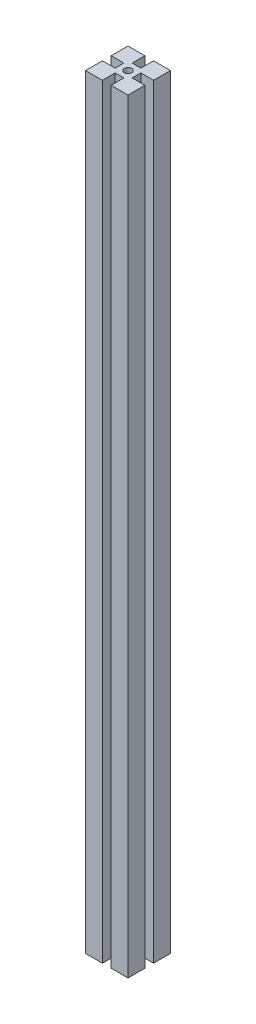
ISO-10303-21;
HEADER;
FILE_DESCRIPTION(('STEP AP214'),'2;1');
FILE_NAME('part.step','',(''),(''),'','','');
FILE_SCHEMA(('AUTOMOTIVE_DESIGN { 1 0 10303 214 1 1 1 1 }'));
ENDSEC;
DATA;
#1=APPLICATION_CONTEXT('core data for automotive mechanical design processes');
#2=APPLICATION_PROTOCOL_DEFINITION('international standard','automotive_design',2000,#1);
#3=PRODUCT_CONTEXT('',#1,'mechanical');
#4=PRODUCT('Part','Part','',(#3));
#5=PRODUCT_RELATED_PRODUCT_CATEGORY('part','',(#4));
#6=PRODUCT_DEFINITION_FORMATION('','',#4);
#7=PRODUCT_DEFINITION_CONTEXT('part definition',#1,'design');
#8=PRODUCT_DEFINITION('design','',#6,#7);
#9=PRODUCT_DEFINITION_SHAPE('','',#8);
#10=(LENGTH_UNIT() NAMED_UNIT(*) SI_UNIT(.MILLI.,.METRE.));
#11=(NAMED_UNIT(*) PLANE_ANGLE_UNIT() SI_UNIT($,.RADIAN.));
#12=(NAMED_UNIT(*) SI_UNIT($,.STERADIAN.) SOLID_ANGLE_UNIT());
#13=UNCERTAINTY_MEASURE_WITH_UNIT(LENGTH_MEASURE(1.E-05),#10,'distance_accuracy_value','');
#14=(GEOMETRIC_REPRESENTATION_CONTEXT(3) GLOBAL_UNCERTAINTY_ASSIGNED_CONTEXT((#13)) GLOBAL_UNIT_ASSIGNED_CONTEXT((#10,
#11,#12)) REPRESENTATION_CONTEXT('',''));
#15=CARTESIAN_POINT('',(0.,0.,0.));
#16=DIRECTION('',(0.,0.,1.));
#17=DIRECTION('',(1.,0.,0.));
#18=AXIS2_PLACEMENT_3D('',#15,#16,#17);
#19=CARTESIAN_POINT('',(0.,720.,0.));
#20=DIRECTION('',(0.,1.,0.));
#21=DIRECTION('',(0.,0.,1.));
#22=AXIS2_PLACEMENT_3D('',#19,#20,#21);
#23=PLANE('',#22);
#24=DIRECTION('',(0.,0.,-1.));
#25=VECTOR('',#24,1.);
#26=CARTESIAN_POINT('',(20.,720.,4.1));
#27=LINE('',#26,#25);
#28=CARTESIAN_POINT('',(20.,720.,20.));
#29=VERTEX_POINT('',#28);
#30=CARTESIAN_POINT('',(20.,720.,4.1));
#31=VERTEX_POINT('',#30);
#32=EDGE_CURVE('E241',#29,#31,#27,.T.);
#33=ORIENTED_EDGE('',*,*,#32,.T.);
#34=DIRECTION('',(-1.,0.,0.));
#35=VECTOR('',#34,1.);
#36=CARTESIAN_POINT('',(8.,720.,4.1));
#37=LINE('',#36,#35);
#38=CARTESIAN_POINT('',(8.,720.,4.1));
#39=VERTEX_POINT('',#38);
#40=EDGE_CURVE('E129',#31,#39,#37,.T.);
#41=ORIENTED_EDGE('',*,*,#40,.T.);
#42=DIRECTION('',(0.,0.,-1.));
#43=VECTOR('',#42,1.);
#44=CARTESIAN_POINT('',(8.,720.,-4.1));
#45=LINE('',#44,#43);
#46=CARTESIAN_POINT('',(8.,720.,-4.1));
#47=VERTEX_POINT('',#46);
#48=EDGE_CURVE('E292',#39,#47,#45,.T.);
#49=ORIENTED_EDGE('',*,*,#48,.T.);
#50=DIRECTION('',(1.,0.,0.));
#51=VECTOR('',#50,1.);
#52=CARTESIAN_POINT('',(20.,720.,-4.1));
#53=LINE('',#52,#51);
#54=CARTESIAN_POINT('',(20.,720.,-4.1));
#55=VERTEX_POINT('',#54);
#56=EDGE_CURVE('E311',#47,#55,#53,.T.);
#57=ORIENTED_EDGE('',*,*,#56,.T.);
#58=DIRECTION('',(0.,0.,-1.));
#59=VECTOR('',#58,1.);
#60=CARTESIAN_POINT('',(20.,720.,-20.));
#61=LINE('',#60,#59);
#62=CARTESIAN_POINT('',(20.,720.,-20.));
#63=VERTEX_POINT('',#62);
#64=EDGE_CURVE('E308',#55,#63,#61,.T.);
#65=ORIENTED_EDGE('',*,*,#64,.T.);
#66=DIRECTION('',(-1.,0.,0.));
#67=VECTOR('',#66,1.);
#68=CARTESIAN_POINT('',(4.10000000000001,720.,-20.));
#69=LINE('',#68,#67);
#70=CARTESIAN_POINT('',(4.10000000000001,720.,-20.));
#71=VERTEX_POINT('',#70);
#72=EDGE_CURVE('E310',#63,#71,#69,.T.);
#73=ORIENTED_EDGE('',*,*,#72,.T.);
#74=DIRECTION('',(0.,0.,1.));
#75=VECTOR('',#74,1.);
#76=CARTESIAN_POINT('',(4.10000000000001,720.,-7.99999999999999));
#77=LINE('',#76,#75);
#78=CARTESIAN_POINT('',(4.10000000000001,720.,-7.99999999999999));
#79=VERTEX_POINT('',#78);
#80=EDGE_CURVE('E313',#71,#79,#77,.T.);
#81=ORIENTED_EDGE('',*,*,#80,.T.);
#82=DIRECTION('',(-1.,0.,0.));
#83=VECTOR('',#82,1.);
#84=CARTESIAN_POINT('',(-4.09999999999999,720.,-7.99999999999999));
#85=LINE('',#84,#83);
#86=CARTESIAN_POINT('',(-4.09999999999999,720.,-7.99999999999999));
#87=VERTEX_POINT('',#86);
#88=EDGE_CURVE('E319',#79,#87,#85,.T.);
#89=ORIENTED_EDGE('',*,*,#88,.T.);
#90=DIRECTION('',(0.,0.,-1.));
#91=VECTOR('',#90,1.);
#92=CARTESIAN_POINT('',(-4.09999999999999,720.,-20.));
#93=LINE('',#92,#91);
#94=CARTESIAN_POINT('',(-4.09999999999999,720.,-20.));
#95=VERTEX_POINT('',#94);
#96=EDGE_CURVE('E321',#87,#95,#93,.T.);
#97=ORIENTED_EDGE('',*,*,#96,.T.);
#98=DIRECTION('',(-1.,0.,0.));
#99=VECTOR('',#98,1.);
#100=CARTESIAN_POINT('',(-20.,720.,-20.));
#101=LINE('',#100,#99);
#102=CARTESIAN_POINT('',(-20.,720.,-20.));
#103=VERTEX_POINT('',#102);
#104=EDGE_CURVE('E323',#95,#103,#101,.T.);
#105=ORIENTED_EDGE('',*,*,#104,.T.);
#106=DIRECTION('',(0.,0.,1.));
#107=VECTOR('',#106,1.);
#108=CARTESIAN_POINT('',(-20.,720.,-20.));
#109=LINE('',#108,#107);
#110=CARTESIAN_POINT('',(-20.,720.,-4.1));
#111=VERTEX_POINT('',#110);
#112=EDGE_CURVE('E325',#103,#111,#109,.T.);
#113=ORIENTED_EDGE('',*,*,#112,.T.);
#114=DIRECTION('',(1.,0.,0.));
#115=VECTOR('',#114,1.);
#116=CARTESIAN_POINT('',(-20.,720.,-4.1));
#117=LINE('',#116,#115);
#118=CARTESIAN_POINT('',(-8.,720.,-4.1));
#119=VERTEX_POINT('',#118);
#120=EDGE_CURVE('E327',#111,#119,#117,.T.);
#121=ORIENTED_EDGE('',*,*,#120,.T.);
#122=DIRECTION('',(0.,0.,1.));
#123=VECTOR('',#122,1.);
#124=CARTESIAN_POINT('',(-8.,720.,-4.1));
#125=LINE('',#124,#123);
#126=CARTESIAN_POINT('',(-8.,720.,4.1));
#127=VERTEX_POINT('',#126);
#128=EDGE_CURVE('E329',#119,#127,#125,.T.);
#129=ORIENTED_EDGE('',*,*,#128,.T.);
#130=DIRECTION('',(-1.,0.,0.));
#131=VECTOR('',#130,1.);
#132=CARTESIAN_POINT('',(-8.,720.,4.1));
#133=LINE('',#132,#131);
#134=CARTESIAN_POINT('',(-20.,720.,4.1));
#135=VERTEX_POINT('',#134);
#136=EDGE_CURVE('E331',#127,#135,#133,.T.);
#137=ORIENTED_EDGE('',*,*,#136,.T.);
#138=DIRECTION('',(0.,0.,1.));
#139=VECTOR('',#138,1.);
#140=CARTESIAN_POINT('',(-20.,720.,4.1));
#141=LINE('',#140,#139);
#142=CARTESIAN_POINT('',(-20.,720.,20.));
#143=VERTEX_POINT('',#142);
#144=EDGE_CURVE('E333',#135,#143,#141,.T.);
#145=ORIENTED_EDGE('',*,*,#144,.T.);
#146=DIRECTION('',(1.,0.,0.));
#147=VECTOR('',#146,1.);
#148=CARTESIAN_POINT('',(-20.,720.,20.));
#149=LINE('',#148,#147);
#150=CARTESIAN_POINT('',(-4.09999999999999,720.,20.));
#151=VERTEX_POINT('',#150);
#152=EDGE_CURVE('E335',#143,#151,#149,.T.);
#153=ORIENTED_EDGE('',*,*,#152,.T.);
#154=DIRECTION('',(0.,0.,-1.));
#155=VECTOR('',#154,1.);
#156=CARTESIAN_POINT('',(-4.09999999999999,720.,20.));
#157=LINE('',#156,#155);
#158=CARTESIAN_POINT('',(-4.09999999999999,720.,7.99999999999999));
#159=VERTEX_POINT('',#158);
#160=EDGE_CURVE('E184',#151,#159,#157,.T.);
#161=ORIENTED_EDGE('',*,*,#160,.T.);
#162=DIRECTION('',(1.,0.,0.));
#163=VECTOR('',#162,1.);
#164=CARTESIAN_POINT('',(-4.09999999999999,720.,7.99999999999999));
#165=LINE('',#164,#163);
#166=CARTESIAN_POINT('',(4.10000000000001,720.,7.99999999999999));
#167=VERTEX_POINT('',#166);
#168=EDGE_CURVE('E178',#159,#167,#165,.T.);
#169=ORIENTED_EDGE('',*,*,#168,.T.);
#170=DIRECTION('',(0.,0.,1.));
#171=VECTOR('',#170,1.);
#172=CARTESIAN_POINT('',(4.10000000000001,720.,7.99999999999999));
#173=LINE('',#172,#171);
#174=CARTESIAN_POINT('',(4.10000000000001,720.,20.));
#175=VERTEX_POINT('',#174);
#176=EDGE_CURVE('E182',#167,#175,#173,.T.);
#177=ORIENTED_EDGE('',*,*,#176,.T.);
#178=DIRECTION('',(1.,0.,0.));
#179=VECTOR('',#178,1.);
#180=CARTESIAN_POINT('',(4.10000000000001,720.,20.));
#181=LINE('',#180,#179);
#182=EDGE_CURVE('E50',#175,#29,#181,.T.);
#183=ORIENTED_EDGE('',*,*,#182,.T.);
#184=EDGE_LOOP('',(#33,#41,#49,#57,#65,#73,#81,#89,#97,#105,#113,#121,#129,#137,#145,#153,#161,
#169,#177,#183));
#185=FACE_BOUND('',#184,.T.);
#186=CARTESIAN_POINT('',(0.,720.,0.));
#187=DIRECTION('',(0.,1.,0.));
#188=DIRECTION('',(0.,0.,1.));
#189=AXIS2_PLACEMENT_3D('',#186,#187,#188);
#190=CIRCLE('',#189,3.5);
#191=CARTESIAN_POINT('',(0.,720.,-3.50000000000001));
#192=VERTEX_POINT('',#191);
#193=EDGE_CURVE('E206',#192,#192,#190,.T.);
#194=ORIENTED_EDGE('',*,*,#193,.F.);
#195=EDGE_LOOP('',(#194));
#196=FACE_BOUND('',#195,.T.);
#197=ADVANCED_FACE('F33',(#185,#196),#23,.T.);
#198=CARTESIAN_POINT('',(0.,0.,0.));
#199=DIRECTION('',(0.,1.,0.));
#200=DIRECTION('',(0.,0.,1.));
#201=AXIS2_PLACEMENT_3D('',#198,#199,#200);
#202=PLANE('',#201);
#203=DIRECTION('',(0.,0.,-1.));
#204=VECTOR('',#203,1.);
#205=CARTESIAN_POINT('',(20.,0.,4.1));
#206=LINE('',#205,#204);
#207=CARTESIAN_POINT('',(20.,0.,20.));
#208=VERTEX_POINT('',#207);
#209=CARTESIAN_POINT('',(20.,0.,4.1));
#210=VERTEX_POINT('',#209);
#211=EDGE_CURVE('E202',#208,#210,#206,.T.);
#212=ORIENTED_EDGE('',*,*,#211,.F.);
#213=DIRECTION('',(1.,0.,0.));
#214=VECTOR('',#213,1.);
#215=CARTESIAN_POINT('',(4.10000000000001,0.,20.));
#216=LINE('',#215,#214);
#217=CARTESIAN_POINT('',(4.10000000000001,0.,20.));
#218=VERTEX_POINT('',#217);
#219=EDGE_CURVE('E121',#218,#208,#216,.T.);
#220=ORIENTED_EDGE('',*,*,#219,.F.);
#221=DIRECTION('',(0.,0.,1.));
#222=VECTOR('',#221,1.);
#223=CARTESIAN_POINT('',(4.10000000000001,0.,7.99999999999999));
#224=LINE('',#223,#222);
#225=CARTESIAN_POINT('',(4.10000000000001,0.,7.99999999999999));
#226=VERTEX_POINT('',#225);
#227=EDGE_CURVE('E115',#226,#218,#224,.T.);
#228=ORIENTED_EDGE('',*,*,#227,.F.);
#229=DIRECTION('',(1.,0.,0.));
#230=VECTOR('',#229,1.);
#231=CARTESIAN_POINT('',(-4.09999999999999,0.,7.99999999999999));
#232=LINE('',#231,#230);
#233=CARTESIAN_POINT('',(-4.09999999999999,0.,7.99999999999999));
#234=VERTEX_POINT('',#233);
#235=EDGE_CURVE('E192',#234,#226,#232,.T.);
#236=ORIENTED_EDGE('',*,*,#235,.F.);
#237=DIRECTION('',(0.,0.,-1.));
#238=VECTOR('',#237,1.);
#239=CARTESIAN_POINT('',(-4.09999999999999,0.,20.));
#240=LINE('',#239,#238);
#241=CARTESIAN_POINT('',(-4.09999999999999,0.,20.));
#242=VERTEX_POINT('',#241);
#243=EDGE_CURVE('E236',#242,#234,#240,.T.);
#244=ORIENTED_EDGE('',*,*,#243,.F.);
#245=DIRECTION('',(1.,0.,0.));
#246=VECTOR('',#245,1.);
#247=CARTESIAN_POINT('',(-20.,0.,20.));
#248=LINE('',#247,#246);
#249=CARTESIAN_POINT('',(-20.,0.,20.));
#250=VERTEX_POINT('',#249);
#251=EDGE_CURVE('E234',#250,#242,#248,.T.);
#252=ORIENTED_EDGE('',*,*,#251,.F.);
#253=DIRECTION('',(0.,0.,1.));
#254=VECTOR('',#253,1.);
#255=CARTESIAN_POINT('',(-20.,0.,4.1));
#256=LINE('',#255,#254);
#257=CARTESIAN_POINT('',(-20.,0.,4.1));
#258=VERTEX_POINT('',#257);
#259=EDGE_CURVE('E232',#258,#250,#256,.T.);
#260=ORIENTED_EDGE('',*,*,#259,.F.);
#261=DIRECTION('',(-1.,0.,0.));
#262=VECTOR('',#261,1.);
#263=CARTESIAN_POINT('',(-8.,0.,4.1));
#264=LINE('',#263,#262);
#265=CARTESIAN_POINT('',(-8.,0.,4.1));
#266=VERTEX_POINT('',#265);
#267=EDGE_CURVE('E230',#266,#258,#264,.T.);
#268=ORIENTED_EDGE('',*,*,#267,.F.);
#269=DIRECTION('',(0.,0.,1.));
#270=VECTOR('',#269,1.);
#271=CARTESIAN_POINT('',(-8.,0.,-4.1));
#272=LINE('',#271,#270);
#273=CARTESIAN_POINT('',(-8.,0.,-4.1));
#274=VERTEX_POINT('',#273);
#275=EDGE_CURVE('E228',#274,#266,#272,.T.);
#276=ORIENTED_EDGE('',*,*,#275,.F.);
#277=DIRECTION('',(1.,0.,0.));
#278=VECTOR('',#277,1.);
#279=CARTESIAN_POINT('',(-20.,0.,-4.1));
#280=LINE('',#279,#278);
#281=CARTESIAN_POINT('',(-20.,0.,-4.1));
#282=VERTEX_POINT('',#281);
#283=EDGE_CURVE('E226',#282,#274,#280,.T.);
#284=ORIENTED_EDGE('',*,*,#283,.F.);
#285=DIRECTION('',(0.,0.,1.));
#286=VECTOR('',#285,1.);
#287=CARTESIAN_POINT('',(-20.,0.,-20.));
#288=LINE('',#287,#286);
#289=CARTESIAN_POINT('',(-20.,0.,-20.));
#290=VERTEX_POINT('',#289);
#291=EDGE_CURVE('E224',#290,#282,#288,.T.);
#292=ORIENTED_EDGE('',*,*,#291,.F.);
#293=DIRECTION('',(-1.,0.,0.));
#294=VECTOR('',#293,1.);
#295=CARTESIAN_POINT('',(-20.,0.,-20.));
#296=LINE('',#295,#294);
#297=CARTESIAN_POINT('',(-4.09999999999999,0.,-20.));
#298=VERTEX_POINT('',#297);
#299=EDGE_CURVE('E222',#298,#290,#296,.T.);
#300=ORIENTED_EDGE('',*,*,#299,.F.);
#301=DIRECTION('',(0.,0.,-1.));
#302=VECTOR('',#301,1.);
#303=CARTESIAN_POINT('',(-4.09999999999999,0.,-20.));
#304=LINE('',#303,#302);
#305=CARTESIAN_POINT('',(-4.09999999999999,0.,-7.99999999999999));
#306=VERTEX_POINT('',#305);
#307=EDGE_CURVE('E220',#306,#298,#304,.T.);
#308=ORIENTED_EDGE('',*,*,#307,.F.);
#309=DIRECTION('',(-1.,0.,0.));
#310=VECTOR('',#309,1.);
#311=CARTESIAN_POINT('',(-4.09999999999999,0.,-7.99999999999999));
#312=LINE('',#311,#310);
#313=CARTESIAN_POINT('',(4.10000000000001,0.,-7.99999999999999));
#314=VERTEX_POINT('',#313);
#315=EDGE_CURVE('E218',#314,#306,#312,.T.);
#316=ORIENTED_EDGE('',*,*,#315,.F.);
#317=DIRECTION('',(0.,0.,1.));
#318=VECTOR('',#317,1.);
#319=CARTESIAN_POINT('',(4.10000000000001,0.,-7.99999999999999));
#320=LINE('',#319,#318);
#321=CARTESIAN_POINT('',(4.10000000000001,0.,-20.));
#322=VERTEX_POINT('',#321);
#323=EDGE_CURVE('E216',#322,#314,#320,.T.);
#324=ORIENTED_EDGE('',*,*,#323,.F.);
#325=DIRECTION('',(-1.,0.,0.));
#326=VECTOR('',#325,1.);
#327=CARTESIAN_POINT('',(4.10000000000001,0.,-20.));
#328=LINE('',#327,#326);
#329=CARTESIAN_POINT('',(20.,0.,-20.));
#330=VERTEX_POINT('',#329);
#331=EDGE_CURVE('E214',#330,#322,#328,.T.);
#332=ORIENTED_EDGE('',*,*,#331,.F.);
#333=DIRECTION('',(0.,0.,-1.));
#334=VECTOR('',#333,1.);
#335=CARTESIAN_POINT('',(20.,0.,-20.));
#336=LINE('',#335,#334);
#337=CARTESIAN_POINT('',(20.,0.,-4.1));
#338=VERTEX_POINT('',#337);
#339=EDGE_CURVE('E212',#338,#330,#336,.T.);
#340=ORIENTED_EDGE('',*,*,#339,.F.);
#341=DIRECTION('',(1.,0.,0.));
#342=VECTOR('',#341,1.);
#343=CARTESIAN_POINT('',(20.,0.,-4.1));
#344=LINE('',#343,#342);
#345=CARTESIAN_POINT('',(8.,0.,-4.1));
#346=VERTEX_POINT('',#345);
#347=EDGE_CURVE('E210',#346,#338,#344,.T.);
#348=ORIENTED_EDGE('',*,*,#347,.F.);
#349=DIRECTION('',(0.,0.,-1.));
#350=VECTOR('',#349,1.);
#351=CARTESIAN_POINT('',(8.,0.,-4.1));
#352=LINE('',#351,#350);
#353=CARTESIAN_POINT('',(8.,0.,4.1));
#354=VERTEX_POINT('',#353);
#355=EDGE_CURVE('E208',#354,#346,#352,.T.);
#356=ORIENTED_EDGE('',*,*,#355,.F.);
#357=DIRECTION('',(-1.,0.,0.));
#358=VECTOR('',#357,1.);
#359=CARTESIAN_POINT('',(8.,0.,4.1));
#360=LINE('',#359,#358);
#361=EDGE_CURVE('E205',#210,#354,#360,.T.);
#362=ORIENTED_EDGE('',*,*,#361,.F.);
#363=EDGE_LOOP('',(#212,#220,#228,#236,#244,#252,#260,#268,#276,#284,#292,#300,#308,#316,#324,
#332,#340,#348,#356,#362));
#364=FACE_BOUND('',#363,.T.);
#365=CARTESIAN_POINT('',(0.,0.,0.));
#366=DIRECTION('',(0.,1.,0.));
#367=DIRECTION('',(0.,0.,1.));
#368=AXIS2_PLACEMENT_3D('',#365,#366,#367);
#369=CIRCLE('',#368,3.5);
#370=CARTESIAN_POINT('',(0.,-1.11022302462516E-13,-3.50000000000001));
#371=VERTEX_POINT('',#370);
#372=EDGE_CURVE('E586',#371,#371,#369,.T.);
#373=ORIENTED_EDGE('',*,*,#372,.T.);
#374=EDGE_LOOP('',(#373));
#375=FACE_BOUND('',#374,.T.);
#376=ADVANCED_FACE('F296',(#364,#375),#202,.F.);
#377=CARTESIAN_POINT('',(20.,720.,4.1));
#378=DIRECTION('',(-1.,0.,0.));
#379=DIRECTION('',(0.,0.,1.));
#380=AXIS2_PLACEMENT_3D('',#377,#378,#379);
#381=PLANE('',#380);
#382=ORIENTED_EDGE('',*,*,#211,.T.);
#383=DIRECTION('',(0.,-1.,0.));
#384=VECTOR('',#383,1.);
#385=CARTESIAN_POINT('',(20.,720.,4.1));
#386=LINE('',#385,#384);
#387=EDGE_CURVE('E11',#31,#210,#386,.T.);
#388=ORIENTED_EDGE('',*,*,#387,.F.);
#389=ORIENTED_EDGE('',*,*,#32,.F.);
#390=DIRECTION('',(0.,-1.,0.));
#391=VECTOR('',#390,1.);
#392=CARTESIAN_POINT('',(20.,720.,20.));
#393=LINE('',#392,#391);
#394=EDGE_CURVE('E198',#29,#208,#393,.T.);
#395=ORIENTED_EDGE('',*,*,#394,.T.);
#396=EDGE_LOOP('',(#382,#388,#389,#395));
#397=FACE_BOUND('',#396,.T.);
#398=ADVANCED_FACE('F35',(#397),#381,.F.);
#399=CARTESIAN_POINT('',(8.,720.,4.1));
#400=DIRECTION('',(0.,0.,1.));
#401=DIRECTION('',(1.,0.,0.));
#402=AXIS2_PLACEMENT_3D('',#399,#400,#401);
#403=PLANE('',#402);
#404=ORIENTED_EDGE('',*,*,#361,.T.);
#405=DIRECTION('',(0.,-1.,0.));
#406=VECTOR('',#405,1.);
#407=CARTESIAN_POINT('',(8.,720.,4.1));
#408=LINE('',#407,#406);
#409=EDGE_CURVE('E42',#39,#354,#408,.T.);
#410=ORIENTED_EDGE('',*,*,#409,.F.);
#411=ORIENTED_EDGE('',*,*,#40,.F.);
#412=ORIENTED_EDGE('',*,*,#387,.T.);
#413=EDGE_LOOP('',(#404,#410,#411,#412));
#414=FACE_BOUND('',#413,.T.);
#415=ADVANCED_FACE('F369',(#414),#403,.F.);
#416=CARTESIAN_POINT('',(8.,720.,-4.1));
#417=DIRECTION('',(-1.,0.,0.));
#418=DIRECTION('',(0.,0.,1.));
#419=AXIS2_PLACEMENT_3D('',#416,#417,#418);
#420=PLANE('',#419);
#421=ORIENTED_EDGE('',*,*,#355,.T.);
#422=DIRECTION('',(0.,-1.,0.));
#423=VECTOR('',#422,1.);
#424=CARTESIAN_POINT('',(8.,720.,-4.1));
#425=LINE('',#424,#423);
#426=EDGE_CURVE('E284',#47,#346,#425,.T.);
#427=ORIENTED_EDGE('',*,*,#426,.F.);
#428=ORIENTED_EDGE('',*,*,#48,.F.);
#429=ORIENTED_EDGE('',*,*,#409,.T.);
#430=EDGE_LOOP('',(#421,#427,#428,#429));
#431=FACE_BOUND('',#430,.T.);
#432=ADVANCED_FACE('F290',(#431),#420,.F.);
#433=CARTESIAN_POINT('',(20.,720.,-4.1));
#434=DIRECTION('',(0.,0.,-1.));
#435=DIRECTION('',(-1.,0.,0.));
#436=AXIS2_PLACEMENT_3D('',#433,#434,#435);
#437=PLANE('',#436);
#438=ORIENTED_EDGE('',*,*,#347,.T.);
#439=DIRECTION('',(0.,-1.,0.));
#440=VECTOR('',#439,1.);
#441=CARTESIAN_POINT('',(20.,720.,-4.1));
#442=LINE('',#441,#440);
#443=EDGE_CURVE('E281',#55,#338,#442,.T.);
#444=ORIENTED_EDGE('',*,*,#443,.F.);
#445=ORIENTED_EDGE('',*,*,#56,.F.);
#446=ORIENTED_EDGE('',*,*,#426,.T.);
#447=EDGE_LOOP('',(#438,#444,#445,#446));
#448=FACE_BOUND('',#447,.T.);
#449=ADVANCED_FACE('F302',(#448),#437,.F.);
#450=CARTESIAN_POINT('',(20.,720.,-20.));
#451=DIRECTION('',(-1.,0.,0.));
#452=DIRECTION('',(0.,0.,1.));
#453=AXIS2_PLACEMENT_3D('',#450,#451,#452);
#454=PLANE('',#453);
#455=ORIENTED_EDGE('',*,*,#339,.T.);
#456=DIRECTION('',(0.,-1.,0.));
#457=VECTOR('',#456,1.);
#458=CARTESIAN_POINT('',(20.,720.,-20.));
#459=LINE('',#458,#457);
#460=EDGE_CURVE('E278',#63,#330,#459,.T.);
#461=ORIENTED_EDGE('',*,*,#460,.F.);
#462=ORIENTED_EDGE('',*,*,#64,.F.);
#463=ORIENTED_EDGE('',*,*,#443,.T.);
#464=EDGE_LOOP('',(#455,#461,#462,#463));
#465=FACE_BOUND('',#464,.T.);
#466=ADVANCED_FACE('F306',(#465),#454,.F.);
#467=CARTESIAN_POINT('',(4.10000000000001,720.,-20.));
#468=DIRECTION('',(0.,0.,1.));
#469=DIRECTION('',(1.,0.,0.));
#470=AXIS2_PLACEMENT_3D('',#467,#468,#469);
#471=PLANE('',#470);
#472=ORIENTED_EDGE('',*,*,#331,.T.);
#473=DIRECTION('',(0.,-1.,0.));
#474=VECTOR('',#473,1.);
#475=CARTESIAN_POINT('',(4.10000000000001,720.,-20.));
#476=LINE('',#475,#474);
#477=EDGE_CURVE('E275',#71,#322,#476,.T.);
#478=ORIENTED_EDGE('',*,*,#477,.F.);
#479=ORIENTED_EDGE('',*,*,#72,.F.);
#480=ORIENTED_EDGE('',*,*,#460,.T.);
#481=EDGE_LOOP('',(#472,#478,#479,#480));
#482=FACE_BOUND('',#481,.T.);
#483=ADVANCED_FACE('F382',(#482),#471,.F.);
#484=CARTESIAN_POINT('',(4.10000000000001,720.,-7.99999999999999));
#485=DIRECTION('',(1.,0.,0.));
#486=DIRECTION('',(0.,0.,-1.));
#487=AXIS2_PLACEMENT_3D('',#484,#485,#486);
#488=PLANE('',#487);
#489=ORIENTED_EDGE('',*,*,#323,.T.);
#490=DIRECTION('',(0.,-1.,0.));
#491=VECTOR('',#490,1.);
#492=CARTESIAN_POINT('',(4.10000000000001,720.,-7.99999999999999));
#493=LINE('',#492,#491);
#494=EDGE_CURVE('E272',#79,#314,#493,.T.);
#495=ORIENTED_EDGE('',*,*,#494,.F.);
#496=ORIENTED_EDGE('',*,*,#80,.F.);
#497=ORIENTED_EDGE('',*,*,#477,.T.);
#498=EDGE_LOOP('',(#489,#495,#496,#497));
#499=FACE_BOUND('',#498,.T.);
#500=ADVANCED_FACE('F385',(#499),#488,.F.);
#501=CARTESIAN_POINT('',(-4.09999999999999,720.,-7.99999999999999));
#502=DIRECTION('',(0.,0.,1.));
#503=DIRECTION('',(1.,0.,0.));
#504=AXIS2_PLACEMENT_3D('',#501,#502,#503);
#505=PLANE('',#504);
#506=ORIENTED_EDGE('',*,*,#315,.T.);
#507=DIRECTION('',(0.,-1.,0.));
#508=VECTOR('',#507,1.);
#509=CARTESIAN_POINT('',(-4.09999999999999,720.,-7.99999999999999));
#510=LINE('',#509,#508);
#511=EDGE_CURVE('E269',#87,#306,#510,.T.);
#512=ORIENTED_EDGE('',*,*,#511,.F.);
#513=ORIENTED_EDGE('',*,*,#88,.F.);
#514=ORIENTED_EDGE('',*,*,#494,.T.);
#515=EDGE_LOOP('',(#506,#512,#513,#514));
#516=FACE_BOUND('',#515,.T.);
#517=ADVANCED_FACE('F389',(#516),#505,.F.);
#518=CARTESIAN_POINT('',(-4.09999999999999,720.,-20.));
#519=DIRECTION('',(-1.,0.,0.));
#520=DIRECTION('',(0.,0.,1.));
#521=AXIS2_PLACEMENT_3D('',#518,#519,#520);
#522=PLANE('',#521);
#523=ORIENTED_EDGE('',*,*,#307,.T.);
#524=DIRECTION('',(0.,-1.,0.));
#525=VECTOR('',#524,1.);
#526=CARTESIAN_POINT('',(-4.09999999999999,720.,-20.));
#527=LINE('',#526,#525);
#528=EDGE_CURVE('E266',#95,#298,#527,.T.);
#529=ORIENTED_EDGE('',*,*,#528,.F.);
#530=ORIENTED_EDGE('',*,*,#96,.F.);
#531=ORIENTED_EDGE('',*,*,#511,.T.);
#532=EDGE_LOOP('',(#523,#529,#530,#531));
#533=FACE_BOUND('',#532,.T.);
#534=ADVANCED_FACE('F393',(#533),#522,.F.);
#535=CARTESIAN_POINT('',(-20.,720.,-20.));
#536=DIRECTION('',(0.,0.,1.));
#537=DIRECTION('',(1.,0.,0.));
#538=AXIS2_PLACEMENT_3D('',#535,#536,#537);
#539=PLANE('',#538);
#540=ORIENTED_EDGE('',*,*,#299,.T.);
#541=DIRECTION('',(0.,-1.,0.));
#542=VECTOR('',#541,1.);
#543=CARTESIAN_POINT('',(-20.,720.,-20.));
#544=LINE('',#543,#542);
#545=EDGE_CURVE('E263',#103,#290,#544,.T.);
#546=ORIENTED_EDGE('',*,*,#545,.F.);
#547=ORIENTED_EDGE('',*,*,#104,.F.);
#548=ORIENTED_EDGE('',*,*,#528,.T.);
#549=EDGE_LOOP('',(#540,#546,#547,#548));
#550=FACE_BOUND('',#549,.T.);
#551=ADVANCED_FACE('F397',(#550),#539,.F.);
#552=CARTESIAN_POINT('',(-20.,720.,-20.));
#553=DIRECTION('',(1.,0.,0.));
#554=DIRECTION('',(0.,0.,-1.));
#555=AXIS2_PLACEMENT_3D('',#552,#553,#554);
#556=PLANE('',#555);
#557=ORIENTED_EDGE('',*,*,#291,.T.);
#558=DIRECTION('',(0.,-1.,0.));
#559=VECTOR('',#558,1.);
#560=CARTESIAN_POINT('',(-20.,720.,-4.1));
#561=LINE('',#560,#559);
#562=EDGE_CURVE('E260',#111,#282,#561,.T.);
#563=ORIENTED_EDGE('',*,*,#562,.F.);
#564=ORIENTED_EDGE('',*,*,#112,.F.);
#565=ORIENTED_EDGE('',*,*,#545,.T.);
#566=EDGE_LOOP('',(#557,#563,#564,#565));
#567=FACE_BOUND('',#566,.T.);
#568=ADVANCED_FACE('F401',(#567),#556,.F.);
#569=CARTESIAN_POINT('',(-20.,720.,-4.1));
#570=DIRECTION('',(0.,0.,-1.));
#571=DIRECTION('',(-1.,0.,0.));
#572=AXIS2_PLACEMENT_3D('',#569,#570,#571);
#573=PLANE('',#572);
#574=ORIENTED_EDGE('',*,*,#283,.T.);
#575=DIRECTION('',(0.,-1.,0.));
#576=VECTOR('',#575,1.);
#577=CARTESIAN_POINT('',(-8.,720.,-4.1));
#578=LINE('',#577,#576);
#579=EDGE_CURVE('E257',#119,#274,#578,.T.);
#580=ORIENTED_EDGE('',*,*,#579,.F.);
#581=ORIENTED_EDGE('',*,*,#120,.F.);
#582=ORIENTED_EDGE('',*,*,#562,.T.);
#583=EDGE_LOOP('',(#574,#580,#581,#582));
#584=FACE_BOUND('',#583,.T.);
#585=ADVANCED_FACE('F405',(#584),#573,.F.);
#586=CARTESIAN_POINT('',(-8.,720.,-4.1));
#587=DIRECTION('',(1.,0.,0.));
#588=DIRECTION('',(0.,0.,-1.));
#589=AXIS2_PLACEMENT_3D('',#586,#587,#588);
#590=PLANE('',#589);
#591=ORIENTED_EDGE('',*,*,#275,.T.);
#592=DIRECTION('',(0.,-1.,0.));
#593=VECTOR('',#592,1.);
#594=CARTESIAN_POINT('',(-8.,720.,4.1));
#595=LINE('',#594,#593);
#596=EDGE_CURVE('E254',#127,#266,#595,.T.);
#597=ORIENTED_EDGE('',*,*,#596,.F.);
#598=ORIENTED_EDGE('',*,*,#128,.F.);
#599=ORIENTED_EDGE('',*,*,#579,.T.);
#600=EDGE_LOOP('',(#591,#597,#598,#599));
#601=FACE_BOUND('',#600,.T.);
#602=ADVANCED_FACE('F409',(#601),#590,.F.);
#603=CARTESIAN_POINT('',(-8.,720.,4.1));
#604=DIRECTION('',(0.,0.,1.));
#605=DIRECTION('',(1.,0.,0.));
#606=AXIS2_PLACEMENT_3D('',#603,#604,#605);
#607=PLANE('',#606);
#608=ORIENTED_EDGE('',*,*,#267,.T.);
#609=DIRECTION('',(0.,-1.,0.));
#610=VECTOR('',#609,1.);
#611=CARTESIAN_POINT('',(-20.,720.,4.1));
#612=LINE('',#611,#610);
#613=EDGE_CURVE('E251',#135,#258,#612,.T.);
#614=ORIENTED_EDGE('',*,*,#613,.F.);
#615=ORIENTED_EDGE('',*,*,#136,.F.);
#616=ORIENTED_EDGE('',*,*,#596,.T.);
#617=EDGE_LOOP('',(#608,#614,#615,#616));
#618=FACE_BOUND('',#617,.T.);
#619=ADVANCED_FACE('F413',(#618),#607,.F.);
#620=CARTESIAN_POINT('',(-20.,720.,4.1));
#621=DIRECTION('',(1.,0.,0.));
#622=DIRECTION('',(0.,0.,-1.));
#623=AXIS2_PLACEMENT_3D('',#620,#621,#622);
#624=PLANE('',#623);
#625=ORIENTED_EDGE('',*,*,#259,.T.);
#626=DIRECTION('',(0.,-1.,0.));
#627=VECTOR('',#626,1.);
#628=CARTESIAN_POINT('',(-20.,720.,20.));
#629=LINE('',#628,#627);
#630=EDGE_CURVE('E248',#143,#250,#629,.T.);
#631=ORIENTED_EDGE('',*,*,#630,.F.);
#632=ORIENTED_EDGE('',*,*,#144,.F.);
#633=ORIENTED_EDGE('',*,*,#613,.T.);
#634=EDGE_LOOP('',(#625,#631,#632,#633));
#635=FACE_BOUND('',#634,.T.);
#636=ADVANCED_FACE('F417',(#635),#624,.F.);
#637=CARTESIAN_POINT('',(-20.,720.,20.));
#638=DIRECTION('',(0.,0.,-1.));
#639=DIRECTION('',(-1.,0.,0.));
#640=AXIS2_PLACEMENT_3D('',#637,#638,#639);
#641=PLANE('',#640);
#642=ORIENTED_EDGE('',*,*,#251,.T.);
#643=DIRECTION('',(0.,-1.,0.));
#644=VECTOR('',#643,1.);
#645=CARTESIAN_POINT('',(-4.09999999999999,720.,20.));
#646=LINE('',#645,#644);
#647=EDGE_CURVE('E245',#151,#242,#646,.T.);
#648=ORIENTED_EDGE('',*,*,#647,.F.);
#649=ORIENTED_EDGE('',*,*,#152,.F.);
#650=ORIENTED_EDGE('',*,*,#630,.T.);
#651=EDGE_LOOP('',(#642,#648,#649,#650));
#652=FACE_BOUND('',#651,.T.);
#653=ADVANCED_FACE('F341',(#652),#641,.F.);
#654=CARTESIAN_POINT('',(-4.09999999999999,720.,20.));
#655=DIRECTION('',(-1.,0.,0.));
#656=DIRECTION('',(0.,0.,1.));
#657=AXIS2_PLACEMENT_3D('',#654,#655,#656);
#658=PLANE('',#657);
#659=ORIENTED_EDGE('',*,*,#243,.T.);
#660=DIRECTION('',(0.,-1.,0.));
#661=VECTOR('',#660,1.);
#662=CARTESIAN_POINT('',(-4.09999999999999,720.,7.99999999999999));
#663=LINE('',#662,#661);
#664=EDGE_CURVE('E193',#159,#234,#663,.T.);
#665=ORIENTED_EDGE('',*,*,#664,.F.);
#666=ORIENTED_EDGE('',*,*,#160,.F.);
#667=ORIENTED_EDGE('',*,*,#647,.T.);
#668=EDGE_LOOP('',(#659,#665,#666,#667));
#669=FACE_BOUND('',#668,.T.);
#670=ADVANCED_FACE('F345',(#669),#658,.F.);
#671=CARTESIAN_POINT('',(-4.09999999999999,720.,7.99999999999999));
#672=DIRECTION('',(0.,0.,-1.));
#673=DIRECTION('',(-1.,0.,0.));
#674=AXIS2_PLACEMENT_3D('',#671,#672,#673);
#675=PLANE('',#674);
#676=ORIENTED_EDGE('',*,*,#235,.T.);
#677=DIRECTION('',(0.,-1.,0.));
#678=VECTOR('',#677,1.);
#679=CARTESIAN_POINT('',(4.10000000000001,720.,7.99999999999999));
#680=LINE('',#679,#678);
#681=EDGE_CURVE('E189',#167,#226,#680,.T.);
#682=ORIENTED_EDGE('',*,*,#681,.F.);
#683=ORIENTED_EDGE('',*,*,#168,.F.);
#684=ORIENTED_EDGE('',*,*,#664,.T.);
#685=EDGE_LOOP('',(#676,#682,#683,#684));
#686=FACE_BOUND('',#685,.T.);
#687=ADVANCED_FACE('F190',(#686),#675,.F.);
#688=CARTESIAN_POINT('',(4.10000000000001,720.,7.99999999999999));
#689=DIRECTION('',(1.,0.,0.));
#690=DIRECTION('',(0.,0.,-1.));
#691=AXIS2_PLACEMENT_3D('',#688,#689,#690);
#692=PLANE('',#691);
#693=ORIENTED_EDGE('',*,*,#227,.T.);
#694=DIRECTION('',(0.,-1.,0.));
#695=VECTOR('',#694,1.);
#696=CARTESIAN_POINT('',(4.10000000000001,720.,20.));
#697=LINE('',#696,#695);
#698=EDGE_CURVE('E194',#175,#218,#697,.T.);
#699=ORIENTED_EDGE('',*,*,#698,.F.);
#700=ORIENTED_EDGE('',*,*,#176,.F.);
#701=ORIENTED_EDGE('',*,*,#681,.T.);
#702=EDGE_LOOP('',(#693,#699,#700,#701));
#703=FACE_BOUND('',#702,.T.);
#704=ADVANCED_FACE('F196',(#703),#692,.F.);
#705=CARTESIAN_POINT('',(4.10000000000001,720.,20.));
#706=DIRECTION('',(0.,0.,-1.));
#707=DIRECTION('',(-1.,0.,0.));
#708=AXIS2_PLACEMENT_3D('',#705,#706,#707);
#709=PLANE('',#708);
#710=ORIENTED_EDGE('',*,*,#219,.T.);
#711=ORIENTED_EDGE('',*,*,#394,.F.);
#712=ORIENTED_EDGE('',*,*,#182,.F.);
#713=ORIENTED_EDGE('',*,*,#698,.T.);
#714=EDGE_LOOP('',(#710,#711,#712,#713));
#715=FACE_BOUND('',#714,.T.);
#716=ADVANCED_FACE('F349',(#715),#709,.F.);
#717=CARTESIAN_POINT('',(0.,720.,0.));
#718=DIRECTION('',(0.,-1.,0.));
#719=DIRECTION('',(0.,0.,-1.));
#720=AXIS2_PLACEMENT_3D('',#717,#718,#719);
#721=CYLINDRICAL_SURFACE('',#720,3.5);
#722=CARTESIAN_POINT('',(0.,720.,-3.50000000000001));
#723=CARTESIAN_POINT('',(0.,712.5,-3.50000000000001));
#724=CARTESIAN_POINT('',(0.,705.,-3.50000000000001));
#725=CARTESIAN_POINT('',(0.,690.,-3.50000000000001));
#726=CARTESIAN_POINT('',(0.,682.5,-3.50000000000001));
#727=CARTESIAN_POINT('',(0.,667.5,-3.50000000000001));
#728=CARTESIAN_POINT('',(0.,660.,-3.50000000000001));
#729=CARTESIAN_POINT('',(0.,645.,-3.50000000000001));
#730=CARTESIAN_POINT('',(0.,637.5,-3.50000000000001));
#731=CARTESIAN_POINT('',(0.,622.5,-3.50000000000001));
#732=CARTESIAN_POINT('',(0.,615.,-3.50000000000001));
#733=CARTESIAN_POINT('',(0.,600.,-3.50000000000001));
#734=CARTESIAN_POINT('',(0.,592.5,-3.50000000000001));
#735=CARTESIAN_POINT('',(0.,577.5,-3.50000000000001));
#736=CARTESIAN_POINT('',(0.,570.,-3.50000000000001));
#737=CARTESIAN_POINT('',(0.,555.,-3.50000000000001));
#738=CARTESIAN_POINT('',(0.,547.5,-3.50000000000001));
#739=CARTESIAN_POINT('',(0.,532.5,-3.50000000000001));
#740=CARTESIAN_POINT('',(0.,525.,-3.50000000000001));
#741=CARTESIAN_POINT('',(0.,510.,-3.50000000000001));
#742=CARTESIAN_POINT('',(0.,502.5,-3.50000000000001));
#743=CARTESIAN_POINT('',(0.,487.5,-3.50000000000001));
#744=CARTESIAN_POINT('',(0.,480.,-3.50000000000001));
#745=CARTESIAN_POINT('',(0.,465.,-3.50000000000001));
#746=CARTESIAN_POINT('',(0.,457.5,-3.50000000000001));
#747=CARTESIAN_POINT('',(0.,442.5,-3.50000000000001));
#748=CARTESIAN_POINT('',(0.,435.,-3.50000000000001));
#749=CARTESIAN_POINT('',(0.,420.,-3.50000000000001));
#750=CARTESIAN_POINT('',(0.,412.5,-3.50000000000001));
#751=CARTESIAN_POINT('',(0.,397.5,-3.50000000000001));
#752=CARTESIAN_POINT('',(0.,390.,-3.50000000000001));
#753=CARTESIAN_POINT('',(0.,375.,-3.50000000000001));
#754=CARTESIAN_POINT('',(0.,367.5,-3.50000000000001));
#755=CARTESIAN_POINT('',(0.,352.5,-3.50000000000001));
#756=CARTESIAN_POINT('',(0.,345.,-3.50000000000001));
#757=CARTESIAN_POINT('',(0.,330.,-3.50000000000001));
#758=CARTESIAN_POINT('',(0.,322.5,-3.50000000000001));
#759=CARTESIAN_POINT('',(0.,307.5,-3.50000000000001));
#760=CARTESIAN_POINT('',(0.,300.,-3.50000000000001));
#761=CARTESIAN_POINT('',(0.,285.,-3.50000000000001));
#762=CARTESIAN_POINT('',(0.,277.5,-3.50000000000001));
#763=CARTESIAN_POINT('',(0.,262.5,-3.50000000000001));
#764=CARTESIAN_POINT('',(0.,255.,-3.50000000000001));
#765=CARTESIAN_POINT('',(0.,240.,-3.50000000000001));
#766=CARTESIAN_POINT('',(0.,232.5,-3.50000000000001));
#767=CARTESIAN_POINT('',(0.,217.5,-3.50000000000001));
#768=CARTESIAN_POINT('',(0.,210.,-3.50000000000001));
#769=CARTESIAN_POINT('',(0.,195.,-3.50000000000001));
#770=CARTESIAN_POINT('',(0.,187.5,-3.50000000000001));
#771=CARTESIAN_POINT('',(0.,172.5,-3.50000000000001));
#772=CARTESIAN_POINT('',(0.,165.,-3.50000000000001));
#773=CARTESIAN_POINT('',(0.,150.,-3.50000000000001));
#774=CARTESIAN_POINT('',(0.,142.5,-3.50000000000001));
#775=CARTESIAN_POINT('',(0.,127.5,-3.50000000000001));
#776=CARTESIAN_POINT('',(0.,120.,-3.50000000000001));
#777=CARTESIAN_POINT('',(0.,105.,-3.50000000000001));
#778=CARTESIAN_POINT('',(0.,97.5,-3.50000000000001));
#779=CARTESIAN_POINT('',(0.,82.4999999999999,-3.50000000000001));
#780=CARTESIAN_POINT('',(0.,74.9999999999999,-3.50000000000001));
#781=CARTESIAN_POINT('',(0.,59.9999999999999,-3.50000000000001));
#782=CARTESIAN_POINT('',(0.,52.4999999999999,-3.50000000000001));
#783=CARTESIAN_POINT('',(0.,37.4999999999999,-3.50000000000001));
#784=CARTESIAN_POINT('',(0.,29.9999999999999,-3.50000000000001));
#785=CARTESIAN_POINT('',(0.,14.9999999999999,-3.50000000000001));
#786=CARTESIAN_POINT('',(0.,7.49999999999989,-3.50000000000001));
#787=CARTESIAN_POINT('',(0.,-1.11022302462516E-13,-3.50000000000001));
#788=B_SPLINE_CURVE_WITH_KNOTS('',3,(#722,#723,#724,#725,#726,#727,#728,#729,#730,#731,#732,
#733,#734,#735,#736,#737,#738,#739,#740,#741,#742,#743,#744,#745,#746,#747,#748,#749,#750,#751,
#752,#753,#754,#755,#756,#757,#758,#759,#760,#761,#762,#763,#764,#765,#766,#767,#768,#769,#770,
#771,#772,#773,#774,#775,#776,#777,#778,#779,#780,#781,#782,#783,#784,#785,#786,#787),
.UNSPECIFIED.,.F.,.F.,(4,2,2,2,2,2,2,2,2,2,2,2,2,2,2,2,2,2,2,2,2,2,2,2,2,2,2,2,2,2,2,2,4),(0.,
22.5000000000001,45.,67.5000000000001,90.0000000000001,112.5,135.,157.5,180.,202.5,225.,247.5,
270.,292.5,315.,337.5,360.,382.5,405.,427.5,450.,472.5,495.,517.5,540.,562.5,585.,607.5,630.,
652.5,675.,697.5,720.),.UNSPECIFIED.);
#789=EDGE_CURVE('BSEAM351',#192,#371,#788,.T.);
#790=ORIENTED_EDGE('',*,*,#193,.T.);
#791=ORIENTED_EDGE('',*,*,#372,.F.);
#792=ORIENTED_EDGE('',*,*,#789,.T.);
#793=ORIENTED_EDGE('',*,*,#789,.F.);
#794=EDGE_LOOP('',(#790,#792,#791,#793));
#795=FACE_BOUND('',#794,.T.);
#796=ADVANCED_FACE('F351',(#795),#721,.F.);
#797=CLOSED_SHELL('',(#197,#376,#398,#415,#432,#449,#466,#483,#500,#517,#534,#551,#568,#585,
#602,#619,#636,#653,#670,#687,#704,#716,#796));
#798=MANIFOLD_SOLID_BREP('B2',#797);
#799=ADVANCED_BREP_SHAPE_REPRESENTATION('',(#18,#798),#14);
#800=SHAPE_DEFINITION_REPRESENTATION(#9,#799);
ENDSEC;
END-ISO-10303-21;
